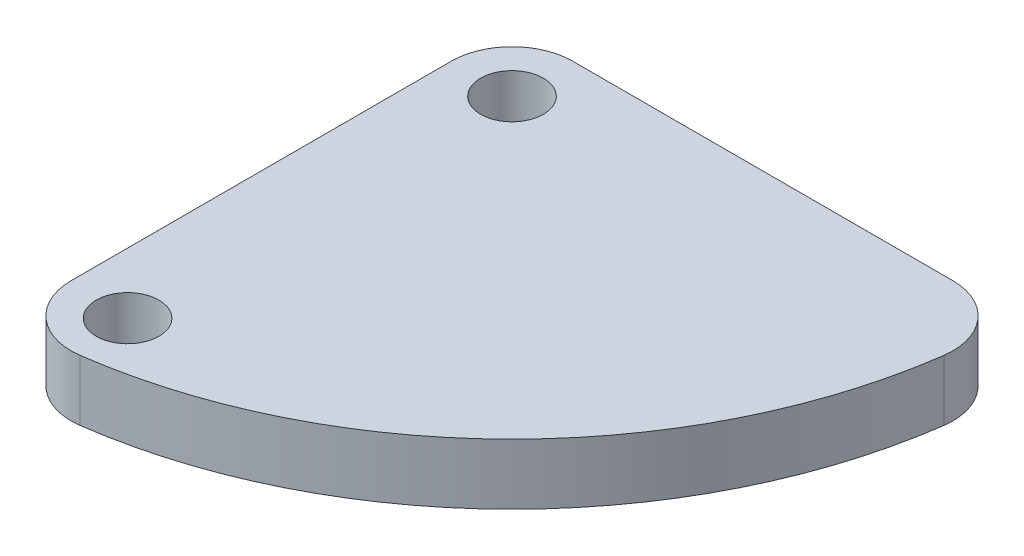
ISO-10303-21;
HEADER;
FILE_DESCRIPTION(('STEP AP214'),'2;1');
FILE_NAME('part.step','',(''),(''),'','','');
FILE_SCHEMA(('AUTOMOTIVE_DESIGN { 1 0 10303 214 1 1 1 1 }'));
ENDSEC;
DATA;
#1=APPLICATION_CONTEXT('core data for automotive mechanical design processes');
#2=APPLICATION_PROTOCOL_DEFINITION('international standard','automotive_design',2000,#1);
#3=PRODUCT_CONTEXT('',#1,'mechanical');
#4=PRODUCT('Part','Part','',(#3));
#5=PRODUCT_RELATED_PRODUCT_CATEGORY('part','',(#4));
#6=PRODUCT_DEFINITION_FORMATION('','',#4);
#7=PRODUCT_DEFINITION_CONTEXT('part definition',#1,'design');
#8=PRODUCT_DEFINITION('design','',#6,#7);
#9=PRODUCT_DEFINITION_SHAPE('','',#8);
#10=(LENGTH_UNIT() NAMED_UNIT(*) SI_UNIT(.MILLI.,.METRE.));
#11=(NAMED_UNIT(*) PLANE_ANGLE_UNIT() SI_UNIT($,.RADIAN.));
#12=(NAMED_UNIT(*) SI_UNIT($,.STERADIAN.) SOLID_ANGLE_UNIT());
#13=UNCERTAINTY_MEASURE_WITH_UNIT(LENGTH_MEASURE(1.E-05),#10,'distance_accuracy_value','');
#14=(GEOMETRIC_REPRESENTATION_CONTEXT(3) GLOBAL_UNCERTAINTY_ASSIGNED_CONTEXT((#13)) GLOBAL_UNIT_ASSIGNED_CONTEXT((#10,
#11,#12)) REPRESENTATION_CONTEXT('',''));
#15=CARTESIAN_POINT('',(0.,0.,0.));
#16=DIRECTION('',(0.,0.,1.));
#17=DIRECTION('',(1.,0.,0.));
#18=AXIS2_PLACEMENT_3D('',#15,#16,#17);
#19=CARTESIAN_POINT('',(-12.5,-3.,12.5));
#20=DIRECTION('',(-1.,0.,0.));
#21=DIRECTION('',(0.,0.,1.));
#22=AXIS2_PLACEMENT_3D('',#19,#20,#21);
#23=PLANE('',#22);
#24=DIRECTION('',(0.,0.,1.));
#25=VECTOR('',#24,1.);
#26=CARTESIAN_POINT('',(-12.5,-3.,12.5));
#27=LINE('',#26,#25);
#28=CARTESIAN_POINT('',(-12.5,-3.,-9.49999999999999));
#29=VERTEX_POINT('',#28);
#30=CARTESIAN_POINT('',(-12.5,-3.,9.29449471770337));
#31=VERTEX_POINT('',#30);
#32=EDGE_CURVE('E124',#29,#31,#27,.T.);
#33=ORIENTED_EDGE('',*,*,#32,.T.);
#34=DIRECTION('',(0.,1.,0.));
#35=VECTOR('',#34,1.);
#36=CARTESIAN_POINT('',(-12.5,-3.,9.29449471770337));
#37=LINE('',#36,#35);
#38=CARTESIAN_POINT('',(-12.5,0.,9.29449471770337));
#39=VERTEX_POINT('',#38);
#40=EDGE_CURVE('E11',#31,#39,#37,.T.);
#41=ORIENTED_EDGE('',*,*,#40,.T.);
#42=DIRECTION('',(0.,0.,1.));
#43=VECTOR('',#42,1.);
#44=CARTESIAN_POINT('',(-12.5,0.,12.5));
#45=LINE('',#44,#43);
#46=CARTESIAN_POINT('',(-12.5,0.,-9.49999999999999));
#47=VERTEX_POINT('',#46);
#48=EDGE_CURVE('E131',#47,#39,#45,.T.);
#49=ORIENTED_EDGE('',*,*,#48,.F.);
#50=DIRECTION('',(0.,1.,0.));
#51=VECTOR('',#50,1.);
#52=CARTESIAN_POINT('',(-12.5,-3.,-9.5));
#53=LINE('',#52,#51);
#54=EDGE_CURVE('E41',#47,#29,#53,.F.);
#55=ORIENTED_EDGE('',*,*,#54,.T.);
#56=EDGE_LOOP('',(#33,#41,#49,#55));
#57=FACE_BOUND('',#56,.T.);
#58=ADVANCED_FACE('F33',(#57),#23,.T.);
#59=CARTESIAN_POINT('',(-12.5,-3.,-12.5));
#60=DIRECTION('',(0.,0.,-1.));
#61=DIRECTION('',(-1.,0.,0.));
#62=AXIS2_PLACEMENT_3D('',#59,#60,#61);
#63=PLANE('',#62);
#64=DIRECTION('',(-1.,0.,0.));
#65=VECTOR('',#64,1.);
#66=CARTESIAN_POINT('',(-12.5,0.,-12.5));
#67=LINE('',#66,#65);
#68=CARTESIAN_POINT('',(9.29449471770337,0.,-12.5));
#69=VERTEX_POINT('',#68);
#70=CARTESIAN_POINT('',(-9.5,0.,-12.5));
#71=VERTEX_POINT('',#70);
#72=EDGE_CURVE('E136',#69,#71,#67,.T.);
#73=ORIENTED_EDGE('',*,*,#72,.F.);
#74=DIRECTION('',(0.,1.,0.));
#75=VECTOR('',#74,1.);
#76=CARTESIAN_POINT('',(9.29449471770337,-3.,-12.5));
#77=LINE('',#76,#75);
#78=CARTESIAN_POINT('',(9.29449471770337,-3.,-12.5));
#79=VERTEX_POINT('',#78);
#80=EDGE_CURVE('E119',#69,#79,#77,.F.);
#81=ORIENTED_EDGE('',*,*,#80,.T.);
#82=DIRECTION('',(-1.,0.,0.));
#83=VECTOR('',#82,1.);
#84=CARTESIAN_POINT('',(-12.5,-3.,-12.5));
#85=LINE('',#84,#83);
#86=CARTESIAN_POINT('',(-9.5,-3.,-12.5));
#87=VERTEX_POINT('',#86);
#88=EDGE_CURVE('E91',#79,#87,#85,.T.);
#89=ORIENTED_EDGE('',*,*,#88,.T.);
#90=DIRECTION('',(0.,1.,0.));
#91=VECTOR('',#90,1.);
#92=CARTESIAN_POINT('',(-9.5,-3.,-12.5));
#93=LINE('',#92,#91);
#94=EDGE_CURVE('E116',#87,#71,#93,.T.);
#95=ORIENTED_EDGE('',*,*,#94,.T.);
#96=EDGE_LOOP('',(#73,#81,#89,#95));
#97=FACE_BOUND('',#96,.T.);
#98=ADVANCED_FACE('F129',(#97),#63,.T.);
#99=CARTESIAN_POINT('',(0.,-3.,0.));
#100=DIRECTION('',(0.,-1.,0.));
#101=DIRECTION('',(0.,0.,-1.));
#102=AXIS2_PLACEMENT_3D('',#99,#100,#101);
#103=PLANE('',#102);
#104=CARTESIAN_POINT('',(-9.4999999999998,-3.,9.5));
#105=DIRECTION('',(0.,1.,0.));
#106=DIRECTION('',(0.,0.,1.));
#107=AXIS2_PLACEMENT_3D('',#104,#105,#106);
#108=CIRCLE('',#107,1.55);
#109=CARTESIAN_POINT('',(-9.4999999999998,-3.,11.05));
#110=VERTEX_POINT('',#109);
#111=EDGE_CURVE('E147',#110,#110,#108,.T.);
#112=ORIENTED_EDGE('',*,*,#111,.T.);
#113=EDGE_LOOP('',(#112));
#114=FACE_BOUND('',#113,.T.);
#115=CARTESIAN_POINT('',(-9.5,-3.,-9.5));
#116=DIRECTION('',(0.,1.,0.));
#117=DIRECTION('',(0.,0.,1.));
#118=AXIS2_PLACEMENT_3D('',#115,#116,#117);
#119=CIRCLE('',#118,1.55);
#120=CARTESIAN_POINT('',(-9.5,-3.,-7.95));
#121=VERTEX_POINT('',#120);
#122=EDGE_CURVE('E139',#121,#121,#119,.T.);
#123=ORIENTED_EDGE('',*,*,#122,.T.);
#124=EDGE_LOOP('',(#123));
#125=FACE_BOUND('',#124,.T.);
#126=ORIENTED_EDGE('',*,*,#88,.F.);
#127=CARTESIAN_POINT('',(9.29449471770337,-3.,-9.5));
#128=DIRECTION('',(0.,-1.,0.));
#129=DIRECTION('',(0.,0.,-1.));
#130=AXIS2_PLACEMENT_3D('',#127,#128,#129);
#131=CIRCLE('',#130,3.);
#132=CARTESIAN_POINT('',(12.2664712701175,-3.,-9.09090909090909));
#133=VERTEX_POINT('',#132);
#134=EDGE_CURVE('E86',#79,#133,#131,.T.);
#135=ORIENTED_EDGE('',*,*,#134,.T.);
#136=CARTESIAN_POINT('',(-12.5,-3.,-12.5));
#137=DIRECTION('',(0.,-1.,0.));
#138=DIRECTION('',(0.,0.,-1.));
#139=AXIS2_PLACEMENT_3D('',#136,#137,#138);
#140=CIRCLE('',#139,25.);
#141=CARTESIAN_POINT('',(-9.09090909090909,-3.,12.2664712701175));
#142=VERTEX_POINT('',#141);
#143=EDGE_CURVE('E89',#133,#142,#140,.T.);
#144=ORIENTED_EDGE('',*,*,#143,.T.);
#145=CARTESIAN_POINT('',(-9.5,-3.,9.29449471770337));
#146=DIRECTION('',(0.,-1.,0.));
#147=DIRECTION('',(0.,0.,-1.));
#148=AXIS2_PLACEMENT_3D('',#145,#146,#147);
#149=CIRCLE('',#148,3.);
#150=EDGE_CURVE('E48',#142,#31,#149,.T.);
#151=ORIENTED_EDGE('',*,*,#150,.T.);
#152=ORIENTED_EDGE('',*,*,#32,.F.);
#153=CARTESIAN_POINT('',(-9.5,-3.,-9.5));
#154=DIRECTION('',(0.,-1.,0.));
#155=DIRECTION('',(0.,0.,-1.));
#156=AXIS2_PLACEMENT_3D('',#153,#154,#155);
#157=CIRCLE('',#156,3.);
#158=EDGE_CURVE('E121',#29,#87,#157,.T.);
#159=ORIENTED_EDGE('',*,*,#158,.T.);
#160=EDGE_LOOP('',(#126,#135,#144,#151,#152,#159));
#161=FACE_BOUND('',#160,.T.);
#162=ADVANCED_FACE('F88',(#114,#125,#161),#103,.T.);
#163=CARTESIAN_POINT('',(0.,0.,0.));
#164=DIRECTION('',(0.,-1.,0.));
#165=DIRECTION('',(0.,0.,-1.));
#166=AXIS2_PLACEMENT_3D('',#163,#164,#165);
#167=PLANE('',#166);
#168=CARTESIAN_POINT('',(-9.4999999999998,0.,9.5));
#169=DIRECTION('',(0.,1.,0.));
#170=DIRECTION('',(0.,0.,1.));
#171=AXIS2_PLACEMENT_3D('',#168,#169,#170);
#172=CIRCLE('',#171,1.55);
#173=CARTESIAN_POINT('',(-9.4999999999998,0.,11.05));
#174=VERTEX_POINT('',#173);
#175=EDGE_CURVE('E150',#174,#174,#172,.T.);
#176=ORIENTED_EDGE('',*,*,#175,.F.);
#177=EDGE_LOOP('',(#176));
#178=FACE_BOUND('',#177,.T.);
#179=CARTESIAN_POINT('',(-9.5,0.,-9.5));
#180=DIRECTION('',(0.,1.,0.));
#181=DIRECTION('',(0.,0.,1.));
#182=AXIS2_PLACEMENT_3D('',#179,#180,#181);
#183=CIRCLE('',#182,1.55);
#184=CARTESIAN_POINT('',(-9.5,0.,-7.95));
#185=VERTEX_POINT('',#184);
#186=EDGE_CURVE('E144',#185,#185,#183,.T.);
#187=ORIENTED_EDGE('',*,*,#186,.F.);
#188=EDGE_LOOP('',(#187));
#189=FACE_BOUND('',#188,.T.);
#190=CARTESIAN_POINT('',(-12.5,0.,-12.5));
#191=DIRECTION('',(0.,-1.,0.));
#192=DIRECTION('',(0.,0.,-1.));
#193=AXIS2_PLACEMENT_3D('',#190,#191,#192);
#194=CIRCLE('',#193,25.);
#195=CARTESIAN_POINT('',(-9.09090909090909,0.,12.2664712701175));
#196=VERTEX_POINT('',#195);
#197=CARTESIAN_POINT('',(12.2664712701175,0.,-9.09090909090909));
#198=VERTEX_POINT('',#197);
#199=EDGE_CURVE('E104',#196,#198,#194,.F.);
#200=ORIENTED_EDGE('',*,*,#199,.T.);
#201=CARTESIAN_POINT('',(9.29449471770337,0.,-9.5));
#202=DIRECTION('',(0.,-1.,0.));
#203=DIRECTION('',(0.,0.,-1.));
#204=AXIS2_PLACEMENT_3D('',#201,#202,#203);
#205=CIRCLE('',#204,3.);
#206=EDGE_CURVE('E107',#198,#69,#205,.F.);
#207=ORIENTED_EDGE('',*,*,#206,.T.);
#208=ORIENTED_EDGE('',*,*,#72,.T.);
#209=CARTESIAN_POINT('',(-9.5,0.,-9.5));
#210=DIRECTION('',(0.,-1.,0.));
#211=DIRECTION('',(0.,0.,-1.));
#212=AXIS2_PLACEMENT_3D('',#209,#210,#211);
#213=CIRCLE('',#212,3.);
#214=EDGE_CURVE('E108',#71,#47,#213,.F.);
#215=ORIENTED_EDGE('',*,*,#214,.T.);
#216=ORIENTED_EDGE('',*,*,#48,.T.);
#217=CARTESIAN_POINT('',(-9.5,0.,9.29449471770337));
#218=DIRECTION('',(0.,-1.,0.));
#219=DIRECTION('',(0.,0.,-1.));
#220=AXIS2_PLACEMENT_3D('',#217,#218,#219);
#221=CIRCLE('',#220,3.);
#222=EDGE_CURVE('E110',#39,#196,#221,.F.);
#223=ORIENTED_EDGE('',*,*,#222,.T.);
#224=EDGE_LOOP('',(#200,#207,#208,#215,#216,#223));
#225=FACE_BOUND('',#224,.T.);
#226=ADVANCED_FACE('F135',(#178,#189,#225),#167,.F.);
#227=CARTESIAN_POINT('',(-9.5,-3.,-9.5));
#228=DIRECTION('',(0.,1.,0.));
#229=DIRECTION('',(0.,0.,1.));
#230=AXIS2_PLACEMENT_3D('',#227,#228,#229);
#231=CYLINDRICAL_SURFACE('',#230,1.55);
#232=ORIENTED_EDGE('',*,*,#122,.F.);
#233=EDGE_LOOP('',(#232));
#234=FACE_BOUND('',#233,.T.);
#235=ORIENTED_EDGE('',*,*,#186,.T.);
#236=EDGE_LOOP('',(#235));
#237=FACE_BOUND('',#236,.T.);
#238=ADVANCED_FACE('F161',(#234,#237),#231,.F.);
#239=CARTESIAN_POINT('',(-9.4999999999998,-3.,9.5));
#240=DIRECTION('',(0.,1.,0.));
#241=DIRECTION('',(0.,0.,1.));
#242=AXIS2_PLACEMENT_3D('',#239,#240,#241);
#243=CYLINDRICAL_SURFACE('',#242,1.55);
#244=ORIENTED_EDGE('',*,*,#111,.F.);
#245=EDGE_LOOP('',(#244));
#246=FACE_BOUND('',#245,.T.);
#247=ORIENTED_EDGE('',*,*,#175,.T.);
#248=EDGE_LOOP('',(#247));
#249=FACE_BOUND('',#248,.T.);
#250=ADVANCED_FACE('F158',(#246,#249),#243,.F.);
#251=CARTESIAN_POINT('',(-12.5,-3.,-12.5));
#252=DIRECTION('',(0.,1.,0.));
#253=DIRECTION('',(0.,0.,1.));
#254=AXIS2_PLACEMENT_3D('',#251,#252,#253);
#255=CYLINDRICAL_SURFACE('',#254,25.);
#256=ORIENTED_EDGE('',*,*,#143,.F.);
#257=DIRECTION('',(0.,1.,0.));
#258=VECTOR('',#257,1.);
#259=CARTESIAN_POINT('',(12.2664712701175,-3.,-9.09090909090909));
#260=LINE('',#259,#258);
#261=EDGE_CURVE('E100',#133,#198,#260,.T.);
#262=ORIENTED_EDGE('',*,*,#261,.T.);
#263=ORIENTED_EDGE('',*,*,#199,.F.);
#264=DIRECTION('',(0.,1.,0.));
#265=VECTOR('',#264,1.);
#266=CARTESIAN_POINT('',(-9.09090909090909,-3.,12.2664712701175));
#267=LINE('',#266,#265);
#268=EDGE_CURVE('E103',#196,#142,#267,.F.);
#269=ORIENTED_EDGE('',*,*,#268,.T.);
#270=EDGE_LOOP('',(#256,#262,#263,#269));
#271=FACE_BOUND('',#270,.T.);
#272=ADVANCED_FACE('F98',(#271),#255,.T.);
#273=CARTESIAN_POINT('',(9.29449471770337,-3.,-9.5));
#274=DIRECTION('',(0.,1.,0.));
#275=DIRECTION('',(0.,0.,1.));
#276=AXIS2_PLACEMENT_3D('',#273,#274,#275);
#277=CYLINDRICAL_SURFACE('',#276,3.);
#278=ORIENTED_EDGE('',*,*,#134,.F.);
#279=ORIENTED_EDGE('',*,*,#80,.F.);
#280=ORIENTED_EDGE('',*,*,#206,.F.);
#281=ORIENTED_EDGE('',*,*,#261,.F.);
#282=EDGE_LOOP('',(#278,#279,#280,#281));
#283=FACE_BOUND('',#282,.T.);
#284=ADVANCED_FACE('F106',(#283),#277,.T.);
#285=CARTESIAN_POINT('',(-9.5,-3.,9.29449471770337));
#286=DIRECTION('',(0.,1.,0.));
#287=DIRECTION('',(0.,0.,1.));
#288=AXIS2_PLACEMENT_3D('',#285,#286,#287);
#289=CYLINDRICAL_SURFACE('',#288,3.);
#290=ORIENTED_EDGE('',*,*,#150,.F.);
#291=ORIENTED_EDGE('',*,*,#268,.F.);
#292=ORIENTED_EDGE('',*,*,#222,.F.);
#293=ORIENTED_EDGE('',*,*,#40,.F.);
#294=EDGE_LOOP('',(#290,#291,#292,#293));
#295=FACE_BOUND('',#294,.T.);
#296=ADVANCED_FACE('F189',(#295),#289,.T.);
#297=CARTESIAN_POINT('',(-9.5,-3.,-9.5));
#298=DIRECTION('',(0.,1.,0.));
#299=DIRECTION('',(0.,0.,1.));
#300=AXIS2_PLACEMENT_3D('',#297,#298,#299);
#301=CYLINDRICAL_SURFACE('',#300,3.);
#302=ORIENTED_EDGE('',*,*,#158,.F.);
#303=ORIENTED_EDGE('',*,*,#54,.F.);
#304=ORIENTED_EDGE('',*,*,#214,.F.);
#305=ORIENTED_EDGE('',*,*,#94,.F.);
#306=EDGE_LOOP('',(#302,#303,#304,#305));
#307=FACE_BOUND('',#306,.T.);
#308=ADVANCED_FACE('F35',(#307),#301,.T.);
#309=CLOSED_SHELL('',(#58,#98,#162,#226,#238,#250,#272,#284,#296,#308));
#310=MANIFOLD_SOLID_BREP('B2',#309);
#311=ADVANCED_BREP_SHAPE_REPRESENTATION('',(#18,#310),#14);
#312=SHAPE_DEFINITION_REPRESENTATION(#9,#311);
ENDSEC;
END-ISO-10303-21;
